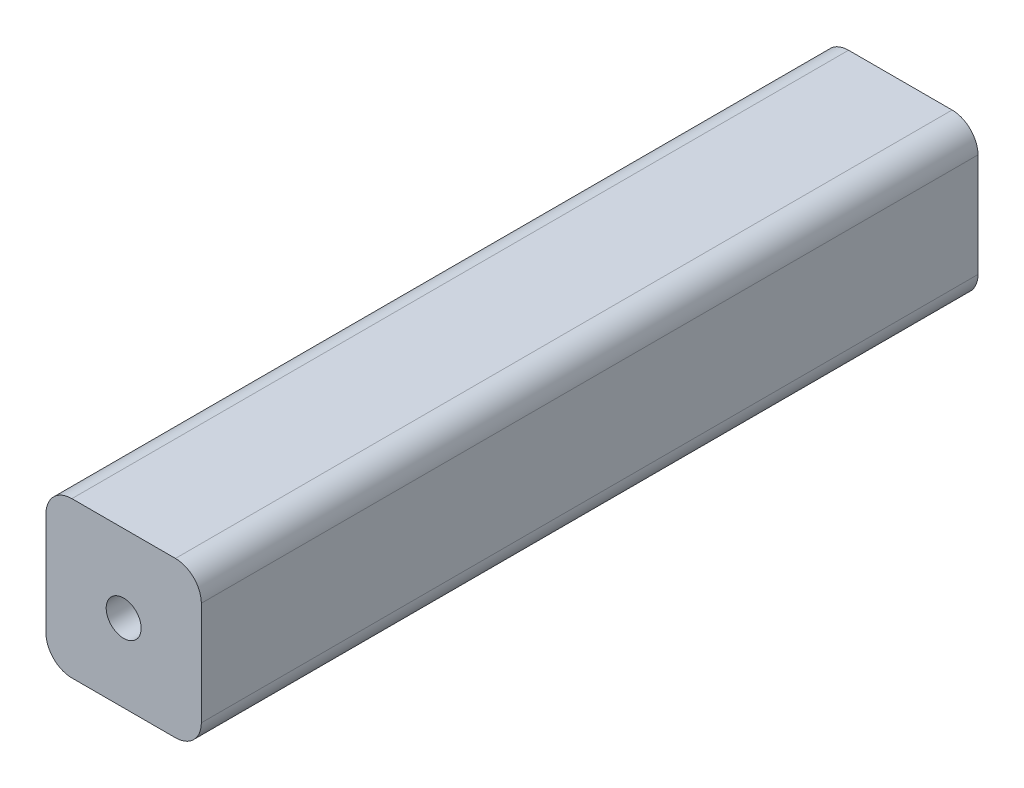
ISO-10303-21;
HEADER;
FILE_DESCRIPTION(('STEP AP214'),'2;1');
FILE_NAME('part.step','',(''),(''),'','','');
FILE_SCHEMA(('AUTOMOTIVE_DESIGN { 1 0 10303 214 1 1 1 1 }'));
ENDSEC;
DATA;
#1=APPLICATION_CONTEXT('core data for automotive mechanical design processes');
#2=APPLICATION_PROTOCOL_DEFINITION('international standard','automotive_design',2000,#1);
#3=PRODUCT_CONTEXT('',#1,'mechanical');
#4=PRODUCT('Part','Part','',(#3));
#5=PRODUCT_RELATED_PRODUCT_CATEGORY('part','',(#4));
#6=PRODUCT_DEFINITION_FORMATION('','',#4);
#7=PRODUCT_DEFINITION_CONTEXT('part definition',#1,'design');
#8=PRODUCT_DEFINITION('design','',#6,#7);
#9=PRODUCT_DEFINITION_SHAPE('','',#8);
#10=(LENGTH_UNIT() NAMED_UNIT(*) SI_UNIT(.MILLI.,.METRE.));
#11=(NAMED_UNIT(*) PLANE_ANGLE_UNIT() SI_UNIT($,.RADIAN.));
#12=(NAMED_UNIT(*) SI_UNIT($,.STERADIAN.) SOLID_ANGLE_UNIT());
#13=UNCERTAINTY_MEASURE_WITH_UNIT(LENGTH_MEASURE(1.E-05),#10,'distance_accuracy_value','');
#14=(GEOMETRIC_REPRESENTATION_CONTEXT(3) GLOBAL_UNCERTAINTY_ASSIGNED_CONTEXT((#13)) GLOBAL_UNIT_ASSIGNED_CONTEXT((#10,
#11,#12)) REPRESENTATION_CONTEXT('',''));
#15=CARTESIAN_POINT('',(0.,0.,0.));
#16=DIRECTION('',(0.,0.,1.));
#17=DIRECTION('',(1.,0.,0.));
#18=AXIS2_PLACEMENT_3D('',#15,#16,#17);
#19=CARTESIAN_POINT('',(-83.,-77.5,60.));
#20=DIRECTION('',(0.,0.,1.));
#21=DIRECTION('',(1.,0.,0.));
#22=AXIS2_PLACEMENT_3D('',#19,#20,#21);
#23=PLANE('',#22);
#24=CARTESIAN_POINT('',(-83.,-77.5,60.));
#25=DIRECTION('',(0.,0.,1.));
#26=DIRECTION('',(1.,0.,0.));
#27=AXIS2_PLACEMENT_3D('',#24,#25,#26);
#28=CIRCLE('',#27,2.);
#29=CARTESIAN_POINT('',(-83.,-75.5,60.));
#30=VERTEX_POINT('',#29);
#31=CARTESIAN_POINT('',(-85.,-77.5000000000001,60.));
#32=VERTEX_POINT('',#31);
#33=EDGE_CURVE('E190',#30,#32,#28,.T.);
#34=ORIENTED_EDGE('',*,*,#33,.T.);
#35=DIRECTION('',(0.,-1.,0.));
#36=VECTOR('',#35,1.);
#37=CARTESIAN_POINT('',(-85.,-77.5000000000001,60.));
#38=LINE('',#37,#36);
#39=CARTESIAN_POINT('',(-85.,-85.5,60.));
#40=VERTEX_POINT('',#39);
#41=EDGE_CURVE('E115',#32,#40,#38,.T.);
#42=ORIENTED_EDGE('',*,*,#41,.T.);
#43=CARTESIAN_POINT('',(-83.,-85.5,60.));
#44=DIRECTION('',(0.,0.,1.));
#45=DIRECTION('',(1.,0.,0.));
#46=AXIS2_PLACEMENT_3D('',#43,#44,#45);
#47=CIRCLE('',#46,2.);
#48=CARTESIAN_POINT('',(-83.,-87.5,60.));
#49=VERTEX_POINT('',#48);
#50=EDGE_CURVE('E212',#40,#49,#47,.T.);
#51=ORIENTED_EDGE('',*,*,#50,.T.);
#52=DIRECTION('',(1.,0.,0.));
#53=VECTOR('',#52,1.);
#54=CARTESIAN_POINT('',(-83.,-87.5,60.));
#55=LINE('',#54,#53);
#56=CARTESIAN_POINT('',(-75.,-87.5,60.));
#57=VERTEX_POINT('',#56);
#58=EDGE_CURVE('E225',#49,#57,#55,.T.);
#59=ORIENTED_EDGE('',*,*,#58,.T.);
#60=CARTESIAN_POINT('',(-75.,-85.5,60.));
#61=DIRECTION('',(0.,0.,1.));
#62=DIRECTION('',(1.,0.,0.));
#63=AXIS2_PLACEMENT_3D('',#60,#61,#62);
#64=CIRCLE('',#63,2.);
#65=CARTESIAN_POINT('',(-73.,-85.5,60.));
#66=VERTEX_POINT('',#65);
#67=EDGE_CURVE('E149',#57,#66,#64,.T.);
#68=ORIENTED_EDGE('',*,*,#67,.T.);
#69=DIRECTION('',(0.,-1.,0.));
#70=VECTOR('',#69,1.);
#71=CARTESIAN_POINT('',(-73.,-77.5000000000001,60.));
#72=LINE('',#71,#70);
#73=CARTESIAN_POINT('',(-73.,-77.5000000000001,60.));
#74=VERTEX_POINT('',#73);
#75=EDGE_CURVE('E134',#74,#66,#72,.T.);
#76=ORIENTED_EDGE('',*,*,#75,.F.);
#77=CARTESIAN_POINT('',(-75.,-77.5,60.));
#78=DIRECTION('',(0.,0.,-1.));
#79=DIRECTION('',(-1.,0.,0.));
#80=AXIS2_PLACEMENT_3D('',#77,#78,#79);
#81=CIRCLE('',#80,2.);
#82=CARTESIAN_POINT('',(-75.,-75.5,60.));
#83=VERTEX_POINT('',#82);
#84=EDGE_CURVE('E147',#83,#74,#81,.T.);
#85=ORIENTED_EDGE('',*,*,#84,.F.);
#86=DIRECTION('',(1.,0.,0.));
#87=VECTOR('',#86,1.);
#88=CARTESIAN_POINT('',(-83.,-75.5,60.));
#89=LINE('',#88,#87);
#90=EDGE_CURVE('E155',#30,#83,#89,.T.);
#91=ORIENTED_EDGE('',*,*,#90,.F.);
#92=EDGE_LOOP('',(#34,#42,#51,#59,#68,#76,#85,#91));
#93=FACE_BOUND('',#92,.T.);
#94=CARTESIAN_POINT('',(-79.,-81.5,60.));
#95=DIRECTION('',(0.,0.,1.));
#96=DIRECTION('',(1.,0.,0.));
#97=AXIS2_PLACEMENT_3D('',#94,#95,#96);
#98=CIRCLE('',#97,1.35000000000001);
#99=CARTESIAN_POINT('',(-77.65,-81.5,60.));
#100=VERTEX_POINT('',#99);
#101=EDGE_CURVE('E168',#100,#100,#98,.T.);
#102=ORIENTED_EDGE('',*,*,#101,.F.);
#103=EDGE_LOOP('',(#102));
#104=FACE_BOUND('',#103,.T.);
#105=ADVANCED_FACE('F59',(#93,#104),#23,.T.);
#106=CARTESIAN_POINT('',(-83.,-77.5,0.));
#107=DIRECTION('',(0.,0.,1.));
#108=DIRECTION('',(1.,0.,0.));
#109=AXIS2_PLACEMENT_3D('',#106,#107,#108);
#110=PLANE('',#109);
#111=CARTESIAN_POINT('',(-83.,-77.5,0.));
#112=DIRECTION('',(0.,0.,1.));
#113=DIRECTION('',(1.,0.,0.));
#114=AXIS2_PLACEMENT_3D('',#111,#112,#113);
#115=CIRCLE('',#114,2.);
#116=CARTESIAN_POINT('',(-83.,-75.5,0.));
#117=VERTEX_POINT('',#116);
#118=CARTESIAN_POINT('',(-85.,-77.5000000000001,0.));
#119=VERTEX_POINT('',#118);
#120=EDGE_CURVE('E164',#117,#119,#115,.T.);
#121=ORIENTED_EDGE('',*,*,#120,.F.);
#122=DIRECTION('',(1.,0.,0.));
#123=VECTOR('',#122,1.);
#124=CARTESIAN_POINT('',(-83.,-75.5,0.));
#125=LINE('',#124,#123);
#126=CARTESIAN_POINT('',(-75.,-75.5,0.));
#127=VERTEX_POINT('',#126);
#128=EDGE_CURVE('E186',#117,#127,#125,.T.);
#129=ORIENTED_EDGE('',*,*,#128,.T.);
#130=CARTESIAN_POINT('',(-75.,-77.5,0.));
#131=DIRECTION('',(0.,0.,-1.));
#132=DIRECTION('',(-1.,0.,0.));
#133=AXIS2_PLACEMENT_3D('',#130,#131,#132);
#134=CIRCLE('',#133,2.);
#135=CARTESIAN_POINT('',(-73.,-77.5000000000001,0.));
#136=VERTEX_POINT('',#135);
#137=EDGE_CURVE('E183',#127,#136,#134,.T.);
#138=ORIENTED_EDGE('',*,*,#137,.T.);
#139=DIRECTION('',(0.,-1.,0.));
#140=VECTOR('',#139,1.);
#141=CARTESIAN_POINT('',(-73.,-77.5000000000001,0.));
#142=LINE('',#141,#140);
#143=CARTESIAN_POINT('',(-73.,-85.5,0.));
#144=VERTEX_POINT('',#143);
#145=EDGE_CURVE('E136',#136,#144,#142,.T.);
#146=ORIENTED_EDGE('',*,*,#145,.T.);
#147=CARTESIAN_POINT('',(-75.,-85.5,0.));
#148=DIRECTION('',(0.,0.,1.));
#149=DIRECTION('',(1.,0.,0.));
#150=AXIS2_PLACEMENT_3D('',#147,#148,#149);
#151=CIRCLE('',#150,2.);
#152=CARTESIAN_POINT('',(-75.,-87.5,0.));
#153=VERTEX_POINT('',#152);
#154=EDGE_CURVE('E177',#153,#144,#151,.T.);
#155=ORIENTED_EDGE('',*,*,#154,.F.);
#156=DIRECTION('',(1.,0.,0.));
#157=VECTOR('',#156,1.);
#158=CARTESIAN_POINT('',(-83.,-87.5,0.));
#159=LINE('',#158,#157);
#160=CARTESIAN_POINT('',(-83.,-87.5,0.));
#161=VERTEX_POINT('',#160);
#162=EDGE_CURVE('E174',#161,#153,#159,.T.);
#163=ORIENTED_EDGE('',*,*,#162,.F.);
#164=CARTESIAN_POINT('',(-83.,-85.5,0.));
#165=DIRECTION('',(0.,0.,1.));
#166=DIRECTION('',(1.,0.,0.));
#167=AXIS2_PLACEMENT_3D('',#164,#165,#166);
#168=CIRCLE('',#167,2.);
#169=CARTESIAN_POINT('',(-85.,-85.5,0.));
#170=VERTEX_POINT('',#169);
#171=EDGE_CURVE('E171',#170,#161,#168,.T.);
#172=ORIENTED_EDGE('',*,*,#171,.F.);
#173=DIRECTION('',(0.,-1.,0.));
#174=VECTOR('',#173,1.);
#175=CARTESIAN_POINT('',(-85.,-77.5000000000001,0.));
#176=LINE('',#175,#174);
#177=EDGE_CURVE('E167',#119,#170,#176,.T.);
#178=ORIENTED_EDGE('',*,*,#177,.F.);
#179=EDGE_LOOP('',(#121,#129,#138,#146,#155,#163,#172,#178));
#180=FACE_BOUND('',#179,.T.);
#181=CARTESIAN_POINT('',(-79.,-81.5,0.));
#182=DIRECTION('',(0.,0.,1.));
#183=DIRECTION('',(1.,0.,0.));
#184=AXIS2_PLACEMENT_3D('',#181,#182,#183);
#185=CIRCLE('',#184,1.35000000000001);
#186=CARTESIAN_POINT('',(-77.65,-81.5,0.));
#187=VERTEX_POINT('',#186);
#188=EDGE_CURVE('E237',#187,#187,#185,.T.);
#189=ORIENTED_EDGE('',*,*,#188,.T.);
#190=EDGE_LOOP('',(#189));
#191=FACE_BOUND('',#190,.T.);
#192=ADVANCED_FACE('F215',(#180,#191),#110,.F.);
#193=CARTESIAN_POINT('',(-83.,-77.5,60.));
#194=DIRECTION('',(0.,0.,-1.));
#195=DIRECTION('',(-1.,0.,0.));
#196=AXIS2_PLACEMENT_3D('',#193,#194,#195);
#197=CYLINDRICAL_SURFACE('',#196,2.);
#198=ORIENTED_EDGE('',*,*,#120,.T.);
#199=DIRECTION('',(0.,0.,-1.));
#200=VECTOR('',#199,1.);
#201=CARTESIAN_POINT('',(-85.,-77.5000000000001,60.));
#202=LINE('',#201,#200);
#203=EDGE_CURVE('E12',#32,#119,#202,.T.);
#204=ORIENTED_EDGE('',*,*,#203,.F.);
#205=ORIENTED_EDGE('',*,*,#33,.F.);
#206=DIRECTION('',(0.,0.,-1.));
#207=VECTOR('',#206,1.);
#208=CARTESIAN_POINT('',(-83.,-75.5,60.));
#209=LINE('',#208,#207);
#210=EDGE_CURVE('E77',#30,#117,#209,.T.);
#211=ORIENTED_EDGE('',*,*,#210,.T.);
#212=EDGE_LOOP('',(#198,#204,#205,#211));
#213=FACE_BOUND('',#212,.T.);
#214=ADVANCED_FACE('F61',(#213),#197,.T.);
#215=CARTESIAN_POINT('',(-85.,-77.5000000000001,60.));
#216=DIRECTION('',(1.,0.,0.));
#217=DIRECTION('',(0.,0.,-1.));
#218=AXIS2_PLACEMENT_3D('',#215,#216,#217);
#219=PLANE('',#218);
#220=ORIENTED_EDGE('',*,*,#177,.T.);
#221=DIRECTION('',(0.,0.,-1.));
#222=VECTOR('',#221,1.);
#223=CARTESIAN_POINT('',(-85.,-85.5,60.));
#224=LINE('',#223,#222);
#225=EDGE_CURVE('E69',#40,#170,#224,.T.);
#226=ORIENTED_EDGE('',*,*,#225,.F.);
#227=ORIENTED_EDGE('',*,*,#41,.F.);
#228=ORIENTED_EDGE('',*,*,#203,.T.);
#229=EDGE_LOOP('',(#220,#226,#227,#228));
#230=FACE_BOUND('',#229,.T.);
#231=ADVANCED_FACE('F268',(#230),#219,.F.);
#232=CARTESIAN_POINT('',(-83.,-85.5,60.));
#233=DIRECTION('',(0.,0.,-1.));
#234=DIRECTION('',(-1.,0.,0.));
#235=AXIS2_PLACEMENT_3D('',#232,#233,#234);
#236=CYLINDRICAL_SURFACE('',#235,2.);
#237=ORIENTED_EDGE('',*,*,#171,.T.);
#238=DIRECTION('',(0.,0.,-1.));
#239=VECTOR('',#238,1.);
#240=CARTESIAN_POINT('',(-83.,-87.5,60.));
#241=LINE('',#240,#239);
#242=EDGE_CURVE('E201',#49,#161,#241,.T.);
#243=ORIENTED_EDGE('',*,*,#242,.F.);
#244=ORIENTED_EDGE('',*,*,#50,.F.);
#245=ORIENTED_EDGE('',*,*,#225,.T.);
#246=EDGE_LOOP('',(#237,#243,#244,#245));
#247=FACE_BOUND('',#246,.T.);
#248=ADVANCED_FACE('F210',(#247),#236,.T.);
#249=CARTESIAN_POINT('',(-83.,-87.5,60.));
#250=DIRECTION('',(0.,1.,0.));
#251=DIRECTION('',(0.,0.,1.));
#252=AXIS2_PLACEMENT_3D('',#249,#250,#251);
#253=PLANE('',#252);
#254=ORIENTED_EDGE('',*,*,#162,.T.);
#255=DIRECTION('',(0.,0.,-1.));
#256=VECTOR('',#255,1.);
#257=CARTESIAN_POINT('',(-75.,-87.5,60.));
#258=LINE('',#257,#256);
#259=EDGE_CURVE('E197',#57,#153,#258,.T.);
#260=ORIENTED_EDGE('',*,*,#259,.F.);
#261=ORIENTED_EDGE('',*,*,#58,.F.);
#262=ORIENTED_EDGE('',*,*,#242,.T.);
#263=EDGE_LOOP('',(#254,#260,#261,#262));
#264=FACE_BOUND('',#263,.T.);
#265=ADVANCED_FACE('F220',(#264),#253,.F.);
#266=CARTESIAN_POINT('',(-75.,-85.5,60.));
#267=DIRECTION('',(0.,0.,-1.));
#268=DIRECTION('',(-1.,0.,0.));
#269=AXIS2_PLACEMENT_3D('',#266,#267,#268);
#270=CYLINDRICAL_SURFACE('',#269,2.);
#271=ORIENTED_EDGE('',*,*,#154,.T.);
#272=DIRECTION('',(0.,0.,-1.));
#273=VECTOR('',#272,1.);
#274=CARTESIAN_POINT('',(-73.,-85.5,60.));
#275=LINE('',#274,#273);
#276=EDGE_CURVE('E141',#66,#144,#275,.T.);
#277=ORIENTED_EDGE('',*,*,#276,.F.);
#278=ORIENTED_EDGE('',*,*,#67,.F.);
#279=ORIENTED_EDGE('',*,*,#259,.T.);
#280=EDGE_LOOP('',(#271,#277,#278,#279));
#281=FACE_BOUND('',#280,.T.);
#282=ADVANCED_FACE('F223',(#281),#270,.T.);
#283=CARTESIAN_POINT('',(-73.,-77.5000000000001,60.));
#284=DIRECTION('',(1.,0.,0.));
#285=DIRECTION('',(0.,0.,-1.));
#286=AXIS2_PLACEMENT_3D('',#283,#284,#285);
#287=PLANE('',#286);
#288=ORIENTED_EDGE('',*,*,#145,.F.);
#289=DIRECTION('',(0.,0.,-1.));
#290=VECTOR('',#289,1.);
#291=CARTESIAN_POINT('',(-73.,-77.5000000000001,60.));
#292=LINE('',#291,#290);
#293=EDGE_CURVE('E131',#74,#136,#292,.T.);
#294=ORIENTED_EDGE('',*,*,#293,.F.);
#295=ORIENTED_EDGE('',*,*,#75,.T.);
#296=ORIENTED_EDGE('',*,*,#276,.T.);
#297=EDGE_LOOP('',(#288,#294,#295,#296));
#298=FACE_BOUND('',#297,.T.);
#299=ADVANCED_FACE('F133',(#298),#287,.T.);
#300=CARTESIAN_POINT('',(-75.,-77.5,60.));
#301=DIRECTION('',(0.,0.,-1.));
#302=DIRECTION('',(-1.,0.,0.));
#303=AXIS2_PLACEMENT_3D('',#300,#301,#302);
#304=CYLINDRICAL_SURFACE('',#303,2.);
#305=ORIENTED_EDGE('',*,*,#137,.F.);
#306=DIRECTION('',(0.,0.,-1.));
#307=VECTOR('',#306,1.);
#308=CARTESIAN_POINT('',(-75.,-75.5,60.));
#309=LINE('',#308,#307);
#310=EDGE_CURVE('E103',#83,#127,#309,.T.);
#311=ORIENTED_EDGE('',*,*,#310,.F.);
#312=ORIENTED_EDGE('',*,*,#84,.T.);
#313=ORIENTED_EDGE('',*,*,#293,.T.);
#314=EDGE_LOOP('',(#305,#311,#312,#313));
#315=FACE_BOUND('',#314,.T.);
#316=ADVANCED_FACE('F153',(#315),#304,.T.);
#317=CARTESIAN_POINT('',(-83.,-75.5,60.));
#318=DIRECTION('',(0.,1.,0.));
#319=DIRECTION('',(0.,0.,1.));
#320=AXIS2_PLACEMENT_3D('',#317,#318,#319);
#321=PLANE('',#320);
#322=ORIENTED_EDGE('',*,*,#128,.F.);
#323=ORIENTED_EDGE('',*,*,#210,.F.);
#324=ORIENTED_EDGE('',*,*,#90,.T.);
#325=ORIENTED_EDGE('',*,*,#310,.T.);
#326=EDGE_LOOP('',(#322,#323,#324,#325));
#327=FACE_BOUND('',#326,.T.);
#328=ADVANCED_FACE('F256',(#327),#321,.T.);
#329=CARTESIAN_POINT('',(-79.,-81.5,60.));
#330=DIRECTION('',(0.,0.,-1.));
#331=DIRECTION('',(-1.,0.,0.));
#332=AXIS2_PLACEMENT_3D('',#329,#330,#331);
#333=CYLINDRICAL_SURFACE('',#332,1.35000000000001);
#334=ORIENTED_EDGE('',*,*,#101,.T.);
#335=EDGE_LOOP('',(#334));
#336=FACE_BOUND('',#335,.T.);
#337=ORIENTED_EDGE('',*,*,#188,.F.);
#338=EDGE_LOOP('',(#337));
#339=FACE_BOUND('',#338,.T.);
#340=ADVANCED_FACE('F247',(#336,#339),#333,.F.);
#341=CLOSED_SHELL('',(#105,#192,#214,#231,#248,#265,#282,#299,#316,#328,#340));
#342=MANIFOLD_SOLID_BREP('B2',#341);
#343=ADVANCED_BREP_SHAPE_REPRESENTATION('',(#18,#342),#14);
#344=SHAPE_DEFINITION_REPRESENTATION(#9,#343);
ENDSEC;
END-ISO-10303-21;
